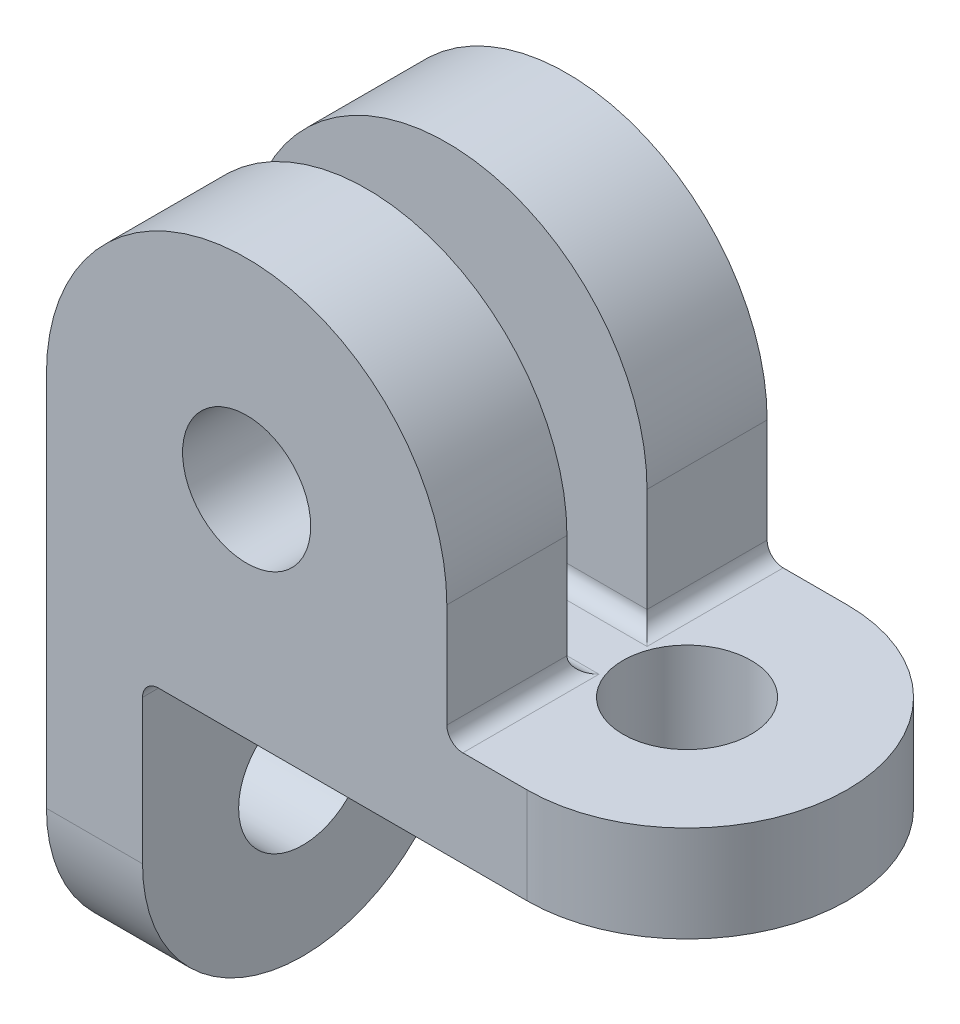
ISO-10303-21;
HEADER;
FILE_DESCRIPTION(('STEP AP214'),'2;1');
FILE_NAME('part.step','',(''),(''),'','','');
FILE_SCHEMA(('AUTOMOTIVE_DESIGN { 1 0 10303 214 1 1 1 1 }'));
ENDSEC;
DATA;
#1=APPLICATION_CONTEXT('core data for automotive mechanical design processes');
#2=APPLICATION_PROTOCOL_DEFINITION('international standard','automotive_design',2000,#1);
#3=PRODUCT_CONTEXT('',#1,'mechanical');
#4=PRODUCT('Part','Part','',(#3));
#5=PRODUCT_RELATED_PRODUCT_CATEGORY('part','',(#4));
#6=PRODUCT_DEFINITION_FORMATION('','',#4);
#7=PRODUCT_DEFINITION_CONTEXT('part definition',#1,'design');
#8=PRODUCT_DEFINITION('design','',#6,#7);
#9=PRODUCT_DEFINITION_SHAPE('','',#8);
#10=(LENGTH_UNIT() NAMED_UNIT(*) SI_UNIT(.MILLI.,.METRE.));
#11=(NAMED_UNIT(*) PLANE_ANGLE_UNIT() SI_UNIT($,.RADIAN.));
#12=(NAMED_UNIT(*) SI_UNIT($,.STERADIAN.) SOLID_ANGLE_UNIT());
#13=UNCERTAINTY_MEASURE_WITH_UNIT(LENGTH_MEASURE(1.E-05),#10,'distance_accuracy_value','');
#14=(GEOMETRIC_REPRESENTATION_CONTEXT(3) GLOBAL_UNCERTAINTY_ASSIGNED_CONTEXT((#13)) GLOBAL_UNIT_ASSIGNED_CONTEXT((#10,
#11,#12)) REPRESENTATION_CONTEXT('',''));
#15=CARTESIAN_POINT('',(0.,0.,0.));
#16=DIRECTION('',(0.,0.,1.));
#17=DIRECTION('',(1.,0.,0.));
#18=AXIS2_PLACEMENT_3D('',#15,#16,#17);
#19=CARTESIAN_POINT('',(-26.,-2.,20.));
#20=DIRECTION('',(0.,0.,-1.));
#21=DIRECTION('',(-1.,0.,0.));
#22=AXIS2_PLACEMENT_3D('',#19,#20,#21);
#23=CYLINDRICAL_SURFACE('',#22,2.);
#24=DIRECTION('',(0.,0.,1.));
#25=VECTOR('',#24,1.);
#26=CARTESIAN_POINT('',(-28.,-2.,20.));
#27=LINE('',#26,#25);
#28=CARTESIAN_POINT('',(-28.,-1.99999999999999,-20.));
#29=VERTEX_POINT('',#28);
#30=CARTESIAN_POINT('',(-28.,-1.99999999999999,20.));
#31=VERTEX_POINT('',#30);
#32=EDGE_CURVE('E309',#29,#31,#27,.T.);
#33=ORIENTED_EDGE('',*,*,#32,.F.);
#34=CARTESIAN_POINT('',(-26.,-2.,-20.));
#35=DIRECTION('',(0.,0.,1.));
#36=DIRECTION('',(1.,0.,0.));
#37=AXIS2_PLACEMENT_3D('',#34,#35,#36);
#38=CIRCLE('',#37,2.);
#39=CARTESIAN_POINT('',(-26.,0.,-20.));
#40=VERTEX_POINT('',#39);
#41=EDGE_CURVE('E53',#29,#40,#38,.F.);
#42=ORIENTED_EDGE('',*,*,#41,.T.);
#43=DIRECTION('',(0.,0.,1.));
#44=VECTOR('',#43,1.);
#45=CARTESIAN_POINT('',(-26.,0.,20.));
#46=LINE('',#45,#44);
#47=CARTESIAN_POINT('',(-26.,0.,20.));
#48=VERTEX_POINT('',#47);
#49=EDGE_CURVE('E313',#48,#40,#46,.F.);
#50=ORIENTED_EDGE('',*,*,#49,.F.);
#51=CARTESIAN_POINT('',(-26.,-2.,20.));
#52=DIRECTION('',(0.,0.,-1.));
#53=DIRECTION('',(-1.,0.,0.));
#54=AXIS2_PLACEMENT_3D('',#51,#52,#53);
#55=CIRCLE('',#54,2.);
#56=EDGE_CURVE('E11',#48,#31,#55,.F.);
#57=ORIENTED_EDGE('',*,*,#56,.T.);
#58=EDGE_LOOP('',(#33,#42,#50,#57));
#59=FACE_BOUND('',#58,.T.);
#60=ADVANCED_FACE('F45',(#59),#23,.F.);
#61=CARTESIAN_POINT('',(12.,14.,-20.));
#62=DIRECTION('',(0.,0.,1.));
#63=DIRECTION('',(1.,0.,0.));
#64=AXIS2_PLACEMENT_3D('',#61,#62,#63);
#65=CYLINDRICAL_SURFACE('',#64,2.);
#66=DIRECTION('',(0.,0.,-1.));
#67=VECTOR('',#66,1.);
#68=CARTESIAN_POINT('',(10.,14.,-20.));
#69=LINE('',#68,#67);
#70=CARTESIAN_POINT('',(10.,14.,-5.));
#71=VERTEX_POINT('',#70);
#72=CARTESIAN_POINT('',(10.,14.,-20.));
#73=VERTEX_POINT('',#72);
#74=EDGE_CURVE('E294',#71,#73,#69,.T.);
#75=ORIENTED_EDGE('',*,*,#74,.F.);
#76=CARTESIAN_POINT('',(12.,14.,-3.));
#77=DIRECTION('',(-0.707106781186547,0.,0.707106781186547));
#78=DIRECTION('',(-0.707106781186547,0.,-0.707106781186547));
#79=AXIS2_PLACEMENT_3D('',#76,#77,#78);
#80=ELLIPSE('',#79,2.82842712474619,2.);
#81=CARTESIAN_POINT('',(12.,12.,-3.));
#82=VERTEX_POINT('',#81);
#83=EDGE_CURVE('E302',#71,#82,#80,.T.);
#84=ORIENTED_EDGE('',*,*,#83,.T.);
#85=DIRECTION('',(0.,0.,-1.));
#86=VECTOR('',#85,1.);
#87=CARTESIAN_POINT('',(12.,12.,-20.));
#88=LINE('',#87,#86);
#89=CARTESIAN_POINT('',(12.,12.,-20.));
#90=VERTEX_POINT('',#89);
#91=EDGE_CURVE('E298',#90,#82,#88,.F.);
#92=ORIENTED_EDGE('',*,*,#91,.F.);
#93=CARTESIAN_POINT('',(12.,14.,-20.));
#94=DIRECTION('',(0.,0.,1.));
#95=DIRECTION('',(1.,0.,0.));
#96=AXIS2_PLACEMENT_3D('',#93,#94,#95);
#97=CIRCLE('',#96,2.);
#98=EDGE_CURVE('E306',#90,#73,#97,.F.);
#99=ORIENTED_EDGE('',*,*,#98,.T.);
#100=EDGE_LOOP('',(#75,#84,#92,#99));
#101=FACE_BOUND('',#100,.T.);
#102=ADVANCED_FACE('F398',(#101),#65,.F.);
#103=CARTESIAN_POINT('',(-40.,14.,-3.));
#104=DIRECTION('',(-1.,0.,0.));
#105=DIRECTION('',(0.,0.,1.));
#106=AXIS2_PLACEMENT_3D('',#103,#104,#105);
#107=CYLINDRICAL_SURFACE('',#106,2.);
#108=DIRECTION('',(1.,0.,0.));
#109=VECTOR('',#108,1.);
#110=CARTESIAN_POINT('',(-40.,14.,-5.));
#111=LINE('',#110,#109);
#112=CARTESIAN_POINT('',(-40.,14.,-5.));
#113=VERTEX_POINT('',#112);
#114=EDGE_CURVE('E283',#113,#71,#111,.T.);
#115=ORIENTED_EDGE('',*,*,#114,.F.);
#116=CARTESIAN_POINT('',(-40.,14.,-3.));
#117=DIRECTION('',(1.,0.,0.));
#118=DIRECTION('',(0.,0.,-1.));
#119=AXIS2_PLACEMENT_3D('',#116,#117,#118);
#120=CIRCLE('',#119,2.);
#121=CARTESIAN_POINT('',(-40.,12.,-3.));
#122=VERTEX_POINT('',#121);
#123=EDGE_CURVE('E291',#113,#122,#120,.F.);
#124=ORIENTED_EDGE('',*,*,#123,.T.);
#125=DIRECTION('',(1.,0.,0.));
#126=VECTOR('',#125,1.);
#127=CARTESIAN_POINT('',(-40.,12.,-3.));
#128=LINE('',#127,#126);
#129=EDGE_CURVE('E287',#82,#122,#128,.F.);
#130=ORIENTED_EDGE('',*,*,#129,.F.);
#131=ORIENTED_EDGE('',*,*,#83,.F.);
#132=EDGE_LOOP('',(#115,#124,#130,#131));
#133=FACE_BOUND('',#132,.T.);
#134=ADVANCED_FACE('F402',(#133),#107,.F.);
#135=CARTESIAN_POINT('',(-40.,14.,3.));
#136=DIRECTION('',(-1.,0.,0.));
#137=DIRECTION('',(0.,0.,1.));
#138=AXIS2_PLACEMENT_3D('',#135,#136,#137);
#139=CYLINDRICAL_SURFACE('',#138,2.);
#140=DIRECTION('',(-1.,0.,0.));
#141=VECTOR('',#140,1.);
#142=CARTESIAN_POINT('',(-40.,14.,5.));
#143=LINE('',#142,#141);
#144=CARTESIAN_POINT('',(10.,14.,5.));
#145=VERTEX_POINT('',#144);
#146=CARTESIAN_POINT('',(-40.,14.,5.));
#147=VERTEX_POINT('',#146);
#148=EDGE_CURVE('E268',#145,#147,#143,.T.);
#149=ORIENTED_EDGE('',*,*,#148,.F.);
#150=CARTESIAN_POINT('',(12.,14.,3.));
#151=DIRECTION('',(-0.707106781186547,0.,-0.707106781186547));
#152=DIRECTION('',(0.707106781186547,0.,-0.707106781186547));
#153=AXIS2_PLACEMENT_3D('',#150,#151,#152);
#154=ELLIPSE('',#153,2.82842712474619,2.);
#155=CARTESIAN_POINT('',(12.,12.,3.));
#156=VERTEX_POINT('',#155);
#157=EDGE_CURVE('E276',#145,#156,#154,.F.);
#158=ORIENTED_EDGE('',*,*,#157,.T.);
#159=DIRECTION('',(-1.,0.,0.));
#160=VECTOR('',#159,1.);
#161=CARTESIAN_POINT('',(0.,12.,3.));
#162=LINE('',#161,#160);
#163=CARTESIAN_POINT('',(-40.,12.,3.));
#164=VERTEX_POINT('',#163);
#165=EDGE_CURVE('E272',#164,#156,#162,.F.);
#166=ORIENTED_EDGE('',*,*,#165,.F.);
#167=CARTESIAN_POINT('',(-40.,14.,3.));
#168=DIRECTION('',(1.,0.,0.));
#169=DIRECTION('',(0.,0.,-1.));
#170=AXIS2_PLACEMENT_3D('',#167,#168,#169);
#171=CIRCLE('',#170,2.);
#172=EDGE_CURVE('E280',#164,#147,#171,.F.);
#173=ORIENTED_EDGE('',*,*,#172,.T.);
#174=EDGE_LOOP('',(#149,#158,#166,#173));
#175=FACE_BOUND('',#174,.T.);
#176=ADVANCED_FACE('F407',(#175),#139,.F.);
#177=CARTESIAN_POINT('',(12.,14.,20.));
#178=DIRECTION('',(0.,0.,-1.));
#179=DIRECTION('',(-1.,0.,0.));
#180=AXIS2_PLACEMENT_3D('',#177,#178,#179);
#181=CYLINDRICAL_SURFACE('',#180,2.);
#182=DIRECTION('',(0.,0.,-1.));
#183=VECTOR('',#182,1.);
#184=CARTESIAN_POINT('',(10.,14.,20.));
#185=LINE('',#184,#183);
#186=CARTESIAN_POINT('',(10.,14.,20.));
#187=VERTEX_POINT('',#186);
#188=EDGE_CURVE('E251',#187,#145,#185,.T.);
#189=ORIENTED_EDGE('',*,*,#188,.F.);
#190=CARTESIAN_POINT('',(12.,14.,20.));
#191=DIRECTION('',(0.,0.,-1.));
#192=DIRECTION('',(-1.,0.,0.));
#193=AXIS2_PLACEMENT_3D('',#190,#191,#192);
#194=CIRCLE('',#193,2.);
#195=CARTESIAN_POINT('',(12.,12.,20.));
#196=VERTEX_POINT('',#195);
#197=EDGE_CURVE('E265',#187,#196,#194,.F.);
#198=ORIENTED_EDGE('',*,*,#197,.T.);
#199=DIRECTION('',(0.,0.,-1.));
#200=VECTOR('',#199,1.);
#201=CARTESIAN_POINT('',(12.,12.,0.));
#202=LINE('',#201,#200);
#203=EDGE_CURVE('E261',#156,#196,#202,.F.);
#204=ORIENTED_EDGE('',*,*,#203,.F.);
#205=ORIENTED_EDGE('',*,*,#157,.F.);
#206=EDGE_LOOP('',(#189,#198,#204,#205));
#207=FACE_BOUND('',#206,.T.);
#208=ADVANCED_FACE('F414',(#207),#181,.F.);
#209=CARTESIAN_POINT('',(-40.,-20.,0.));
#210=DIRECTION('',(-1.,0.,0.));
#211=DIRECTION('',(0.,0.,1.));
#212=AXIS2_PLACEMENT_3D('',#209,#210,#211);
#213=CYLINDRICAL_SURFACE('',#212,20.);
#214=DIRECTION('',(1.,0.,0.));
#215=VECTOR('',#214,1.);
#216=CARTESIAN_POINT('',(-40.,-20.,20.));
#217=LINE('',#216,#215);
#218=CARTESIAN_POINT('',(-40.,-20.,20.));
#219=VERTEX_POINT('',#218);
#220=CARTESIAN_POINT('',(-28.,-20.,20.));
#221=VERTEX_POINT('',#220);
#222=EDGE_CURVE('E226',#219,#221,#217,.T.);
#223=ORIENTED_EDGE('',*,*,#222,.F.);
#224=CARTESIAN_POINT('',(-40.,-20.,0.));
#225=DIRECTION('',(1.,0.,0.));
#226=DIRECTION('',(0.,0.,-1.));
#227=AXIS2_PLACEMENT_3D('',#224,#225,#226);
#228=CIRCLE('',#227,20.);
#229=CARTESIAN_POINT('',(-40.,-20.,-20.));
#230=VERTEX_POINT('',#229);
#231=EDGE_CURVE('E245',#230,#219,#228,.F.);
#232=ORIENTED_EDGE('',*,*,#231,.F.);
#233=DIRECTION('',(1.,0.,0.));
#234=VECTOR('',#233,1.);
#235=CARTESIAN_POINT('',(-40.,-20.,-20.));
#236=LINE('',#235,#234);
#237=CARTESIAN_POINT('',(-28.,-20.,-20.));
#238=VERTEX_POINT('',#237);
#239=EDGE_CURVE('E241',#238,#230,#236,.F.);
#240=ORIENTED_EDGE('',*,*,#239,.F.);
#241=CARTESIAN_POINT('',(-28.,-20.,0.));
#242=DIRECTION('',(-1.,0.,0.));
#243=DIRECTION('',(0.,0.,1.));
#244=AXIS2_PLACEMENT_3D('',#241,#242,#243);
#245=CIRCLE('',#244,20.);
#246=EDGE_CURVE('E248',#221,#238,#245,.F.);
#247=ORIENTED_EDGE('',*,*,#246,.F.);
#248=EDGE_LOOP('',(#223,#232,#240,#247));
#249=FACE_BOUND('',#248,.T.);
#250=ADVANCED_FACE('F393',(#249),#213,.T.);
#251=CARTESIAN_POINT('',(0.,0.,0.));
#252=DIRECTION('',(0.,1.,0.));
#253=DIRECTION('',(0.,0.,1.));
#254=AXIS2_PLACEMENT_3D('',#251,#252,#253);
#255=PLANE('',#254);
#256=CARTESIAN_POINT('',(20.,0.,0.));
#257=DIRECTION('',(0.,1.,0.));
#258=DIRECTION('',(0.,0.,1.));
#259=AXIS2_PLACEMENT_3D('',#256,#257,#258);
#260=CIRCLE('',#259,8.);
#261=CARTESIAN_POINT('',(20.,0.,8.));
#262=VERTEX_POINT('',#261);
#263=EDGE_CURVE('E233',#262,#262,#260,.T.);
#264=ORIENTED_EDGE('',*,*,#263,.T.);
#265=EDGE_LOOP('',(#264));
#266=FACE_BOUND('',#265,.T.);
#267=DIRECTION('',(1.,0.,0.));
#268=VECTOR('',#267,1.);
#269=CARTESIAN_POINT('',(-40.,0.,20.));
#270=LINE('',#269,#268);
#271=CARTESIAN_POINT('',(20.,0.,20.));
#272=VERTEX_POINT('',#271);
#273=EDGE_CURVE('E154',#48,#272,#270,.T.);
#274=ORIENTED_EDGE('',*,*,#273,.F.);
#275=ORIENTED_EDGE('',*,*,#49,.T.);
#276=DIRECTION('',(-1.,0.,0.));
#277=VECTOR('',#276,1.);
#278=CARTESIAN_POINT('',(-40.,0.,-20.));
#279=LINE('',#278,#277);
#280=CARTESIAN_POINT('',(20.,0.,-20.));
#281=VERTEX_POINT('',#280);
#282=EDGE_CURVE('E164',#281,#40,#279,.T.);
#283=ORIENTED_EDGE('',*,*,#282,.F.);
#284=CARTESIAN_POINT('',(20.,0.,0.));
#285=DIRECTION('',(0.,1.,0.));
#286=DIRECTION('',(0.,0.,1.));
#287=AXIS2_PLACEMENT_3D('',#284,#285,#286);
#288=CIRCLE('',#287,20.);
#289=EDGE_CURVE('E167',#281,#272,#288,.F.);
#290=ORIENTED_EDGE('',*,*,#289,.T.);
#291=EDGE_LOOP('',(#274,#275,#283,#290));
#292=FACE_BOUND('',#291,.T.);
#293=ADVANCED_FACE('F168',(#266,#292),#255,.F.);
#294=CARTESIAN_POINT('',(-15.,27.,-5.));
#295=DIRECTION('',(0.,0.,-1.));
#296=DIRECTION('',(-1.,0.,0.));
#297=AXIS2_PLACEMENT_3D('',#294,#295,#296);
#298=CYLINDRICAL_SURFACE('',#297,25.);
#299=DIRECTION('',(0.,0.,-1.));
#300=VECTOR('',#299,1.);
#301=CARTESIAN_POINT('',(-40.,27.,-20.));
#302=LINE('',#301,#300);
#303=CARTESIAN_POINT('',(-40.,27.,-5.));
#304=VERTEX_POINT('',#303);
#305=CARTESIAN_POINT('',(-40.,27.,-20.));
#306=VERTEX_POINT('',#305);
#307=EDGE_CURVE('E206',#304,#306,#302,.T.);
#308=ORIENTED_EDGE('',*,*,#307,.F.);
#309=CARTESIAN_POINT('',(-15.,27.,-5.));
#310=DIRECTION('',(0.,0.,1.));
#311=DIRECTION('',(1.,0.,0.));
#312=AXIS2_PLACEMENT_3D('',#309,#310,#311);
#313=CIRCLE('',#312,25.);
#314=CARTESIAN_POINT('',(10.,27.,-5.));
#315=VERTEX_POINT('',#314);
#316=EDGE_CURVE('E220',#315,#304,#313,.T.);
#317=ORIENTED_EDGE('',*,*,#316,.F.);
#318=DIRECTION('',(0.,0.,1.));
#319=VECTOR('',#318,1.);
#320=CARTESIAN_POINT('',(10.,27.,-5.));
#321=LINE('',#320,#319);
#322=CARTESIAN_POINT('',(10.,27.,-20.));
#323=VERTEX_POINT('',#322);
#324=EDGE_CURVE('E216',#323,#315,#321,.T.);
#325=ORIENTED_EDGE('',*,*,#324,.F.);
#326=CARTESIAN_POINT('',(-15.,27.,-20.));
#327=DIRECTION('',(0.,0.,1.));
#328=DIRECTION('',(1.,0.,0.));
#329=AXIS2_PLACEMENT_3D('',#326,#327,#328);
#330=CIRCLE('',#329,25.);
#331=EDGE_CURVE('E223',#306,#323,#330,.F.);
#332=ORIENTED_EDGE('',*,*,#331,.F.);
#333=EDGE_LOOP('',(#308,#317,#325,#332));
#334=FACE_BOUND('',#333,.T.);
#335=ADVANCED_FACE('F425',(#334),#298,.T.);
#336=CARTESIAN_POINT('',(-15.,27.,20.));
#337=DIRECTION('',(0.,0.,1.));
#338=DIRECTION('',(1.,0.,0.));
#339=AXIS2_PLACEMENT_3D('',#336,#337,#338);
#340=CYLINDRICAL_SURFACE('',#339,25.);
#341=DIRECTION('',(0.,0.,1.));
#342=VECTOR('',#341,1.);
#343=CARTESIAN_POINT('',(-40.,27.,-20.));
#344=LINE('',#343,#342);
#345=CARTESIAN_POINT('',(-40.,27.,20.));
#346=VERTEX_POINT('',#345);
#347=CARTESIAN_POINT('',(-40.,27.,5.));
#348=VERTEX_POINT('',#347);
#349=EDGE_CURVE('E192',#346,#348,#344,.F.);
#350=ORIENTED_EDGE('',*,*,#349,.F.);
#351=CARTESIAN_POINT('',(-15.,27.,20.));
#352=DIRECTION('',(0.,0.,-1.));
#353=DIRECTION('',(-1.,0.,0.));
#354=AXIS2_PLACEMENT_3D('',#351,#352,#353);
#355=CIRCLE('',#354,25.);
#356=CARTESIAN_POINT('',(10.,27.,20.));
#357=VERTEX_POINT('',#356);
#358=EDGE_CURVE('E200',#357,#346,#355,.F.);
#359=ORIENTED_EDGE('',*,*,#358,.F.);
#360=DIRECTION('',(0.,0.,1.));
#361=VECTOR('',#360,1.);
#362=CARTESIAN_POINT('',(10.,27.,20.));
#363=LINE('',#362,#361);
#364=CARTESIAN_POINT('',(10.,27.,5.));
#365=VERTEX_POINT('',#364);
#366=EDGE_CURVE('E196',#365,#357,#363,.T.);
#367=ORIENTED_EDGE('',*,*,#366,.F.);
#368=CARTESIAN_POINT('',(-15.,27.,5.));
#369=DIRECTION('',(0.,0.,1.));
#370=DIRECTION('',(1.,0.,0.));
#371=AXIS2_PLACEMENT_3D('',#368,#369,#370);
#372=CIRCLE('',#371,25.);
#373=EDGE_CURVE('E203',#348,#365,#372,.F.);
#374=ORIENTED_EDGE('',*,*,#373,.F.);
#375=EDGE_LOOP('',(#350,#359,#367,#374));
#376=FACE_BOUND('',#375,.T.);
#377=ADVANCED_FACE('F431',(#376),#340,.T.);
#378=CARTESIAN_POINT('',(20.,0.,0.));
#379=DIRECTION('',(0.,-1.,0.));
#380=DIRECTION('',(0.,0.,-1.));
#381=AXIS2_PLACEMENT_3D('',#378,#379,#380);
#382=CYLINDRICAL_SURFACE('',#381,20.);
#383=DIRECTION('',(0.,-1.,0.));
#384=VECTOR('',#383,1.);
#385=CARTESIAN_POINT('',(20.,12.,20.));
#386=LINE('',#385,#384);
#387=CARTESIAN_POINT('',(20.,12.,20.));
#388=VERTEX_POINT('',#387);
#389=EDGE_CURVE('E160',#272,#388,#386,.F.);
#390=ORIENTED_EDGE('',*,*,#389,.F.);
#391=ORIENTED_EDGE('',*,*,#289,.F.);
#392=DIRECTION('',(0.,-1.,0.));
#393=VECTOR('',#392,1.);
#394=CARTESIAN_POINT('',(20.,12.,-20.));
#395=LINE('',#394,#393);
#396=CARTESIAN_POINT('',(20.,12.,-20.));
#397=VERTEX_POINT('',#396);
#398=EDGE_CURVE('E175',#397,#281,#395,.T.);
#399=ORIENTED_EDGE('',*,*,#398,.F.);
#400=CARTESIAN_POINT('',(20.,12.,0.));
#401=DIRECTION('',(0.,1.,0.));
#402=DIRECTION('',(0.,0.,1.));
#403=AXIS2_PLACEMENT_3D('',#400,#401,#402);
#404=CIRCLE('',#403,20.);
#405=EDGE_CURVE('E174',#388,#397,#404,.T.);
#406=ORIENTED_EDGE('',*,*,#405,.F.);
#407=EDGE_LOOP('',(#390,#391,#399,#406));
#408=FACE_BOUND('',#407,.T.);
#409=ADVANCED_FACE('F178',(#408),#382,.T.);
#410=CARTESIAN_POINT('',(-40.,12.,-20.));
#411=DIRECTION('',(0.,0.,1.));
#412=DIRECTION('',(1.,0.,0.));
#413=AXIS2_PLACEMENT_3D('',#410,#411,#412);
#414=PLANE('',#413);
#415=CARTESIAN_POINT('',(-15.,27.,-20.));
#416=DIRECTION('',(0.,0.,1.));
#417=DIRECTION('',(1.,0.,0.));
#418=AXIS2_PLACEMENT_3D('',#415,#416,#417);
#419=CIRCLE('',#418,8.);
#420=CARTESIAN_POINT('',(-7.,27.,-20.));
#421=VERTEX_POINT('',#420);
#422=EDGE_CURVE('E232',#421,#421,#419,.T.);
#423=ORIENTED_EDGE('',*,*,#422,.T.);
#424=EDGE_LOOP('',(#423));
#425=FACE_BOUND('',#424,.T.);
#426=DIRECTION('',(0.,1.,0.));
#427=VECTOR('',#426,1.);
#428=CARTESIAN_POINT('',(-28.,-40.,-20.));
#429=LINE('',#428,#427);
#430=EDGE_CURVE('E369',#238,#29,#429,.T.);
#431=ORIENTED_EDGE('',*,*,#430,.F.);
#432=ORIENTED_EDGE('',*,*,#239,.T.);
#433=DIRECTION('',(0.,-1.,0.));
#434=VECTOR('',#433,1.);
#435=CARTESIAN_POINT('',(-40.,12.,-20.));
#436=LINE('',#435,#434);
#437=EDGE_CURVE('E180',#306,#230,#436,.T.);
#438=ORIENTED_EDGE('',*,*,#437,.F.);
#439=ORIENTED_EDGE('',*,*,#331,.T.);
#440=DIRECTION('',(0.,-1.,0.));
#441=VECTOR('',#440,1.);
#442=CARTESIAN_POINT('',(10.,52.,-20.));
#443=LINE('',#442,#441);
#444=EDGE_CURVE('E231',#323,#73,#443,.T.);
#445=ORIENTED_EDGE('',*,*,#444,.T.);
#446=ORIENTED_EDGE('',*,*,#98,.F.);
#447=DIRECTION('',(-1.,0.,0.));
#448=VECTOR('',#447,1.);
#449=CARTESIAN_POINT('',(-40.,12.,-20.));
#450=LINE('',#449,#448);
#451=EDGE_CURVE('E163',#397,#90,#450,.T.);
#452=ORIENTED_EDGE('',*,*,#451,.F.);
#453=ORIENTED_EDGE('',*,*,#398,.T.);
#454=ORIENTED_EDGE('',*,*,#282,.T.);
#455=ORIENTED_EDGE('',*,*,#41,.F.);
#456=EDGE_LOOP('',(#431,#432,#438,#439,#445,#446,#452,#453,#454,#455));
#457=FACE_BOUND('',#456,.T.);
#458=ADVANCED_FACE('F318',(#425,#457),#414,.F.);
#459=CARTESIAN_POINT('',(-40.,12.,-20.));
#460=DIRECTION('',(1.,0.,0.));
#461=DIRECTION('',(0.,0.,-1.));
#462=AXIS2_PLACEMENT_3D('',#459,#460,#461);
#463=PLANE('',#462);
#464=CARTESIAN_POINT('',(-40.,-20.,0.));
#465=DIRECTION('',(-1.,0.,0.));
#466=DIRECTION('',(0.,0.,1.));
#467=AXIS2_PLACEMENT_3D('',#464,#465,#466);
#468=CIRCLE('',#467,8.);
#469=CARTESIAN_POINT('',(-40.,-20.,8.));
#470=VERTEX_POINT('',#469);
#471=EDGE_CURVE('E257',#470,#470,#468,.T.);
#472=ORIENTED_EDGE('',*,*,#471,.F.);
#473=EDGE_LOOP('',(#472));
#474=FACE_BOUND('',#473,.T.);
#475=ORIENTED_EDGE('',*,*,#437,.T.);
#476=ORIENTED_EDGE('',*,*,#231,.T.);
#477=DIRECTION('',(0.,-1.,0.));
#478=VECTOR('',#477,1.);
#479=CARTESIAN_POINT('',(-40.,12.,20.));
#480=LINE('',#479,#478);
#481=EDGE_CURVE('E186',#346,#219,#480,.T.);
#482=ORIENTED_EDGE('',*,*,#481,.F.);
#483=ORIENTED_EDGE('',*,*,#349,.T.);
#484=DIRECTION('',(0.,-1.,0.));
#485=VECTOR('',#484,1.);
#486=CARTESIAN_POINT('',(-40.,52.,5.));
#487=LINE('',#486,#485);
#488=EDGE_CURVE('E211',#348,#147,#487,.T.);
#489=ORIENTED_EDGE('',*,*,#488,.T.);
#490=ORIENTED_EDGE('',*,*,#172,.F.);
#491=DIRECTION('',(0.,0.,1.));
#492=VECTOR('',#491,1.);
#493=CARTESIAN_POINT('',(-40.,12.,-20.));
#494=LINE('',#493,#492);
#495=EDGE_CURVE('E334',#122,#164,#494,.T.);
#496=ORIENTED_EDGE('',*,*,#495,.F.);
#497=ORIENTED_EDGE('',*,*,#123,.F.);
#498=DIRECTION('',(0.,-1.,0.));
#499=VECTOR('',#498,1.);
#500=CARTESIAN_POINT('',(-40.,52.,-5.));
#501=LINE('',#500,#499);
#502=EDGE_CURVE('E352',#304,#113,#501,.T.);
#503=ORIENTED_EDGE('',*,*,#502,.F.);
#504=ORIENTED_EDGE('',*,*,#307,.T.);
#505=EDGE_LOOP('',(#475,#476,#482,#483,#489,#490,#496,#497,#503,#504));
#506=FACE_BOUND('',#505,.T.);
#507=ADVANCED_FACE('F382',(#474,#506),#463,.F.);
#508=CARTESIAN_POINT('',(-40.,12.,20.));
#509=DIRECTION('',(0.,0.,-1.));
#510=DIRECTION('',(-1.,0.,0.));
#511=AXIS2_PLACEMENT_3D('',#508,#509,#510);
#512=PLANE('',#511);
#513=ORIENTED_EDGE('',*,*,#56,.F.);
#514=ORIENTED_EDGE('',*,*,#273,.T.);
#515=ORIENTED_EDGE('',*,*,#389,.T.);
#516=DIRECTION('',(1.,0.,0.));
#517=VECTOR('',#516,1.);
#518=CARTESIAN_POINT('',(-40.,12.,20.));
#519=LINE('',#518,#517);
#520=EDGE_CURVE('E328',#196,#388,#519,.T.);
#521=ORIENTED_EDGE('',*,*,#520,.F.);
#522=ORIENTED_EDGE('',*,*,#197,.F.);
#523=DIRECTION('',(0.,-1.,0.));
#524=VECTOR('',#523,1.);
#525=CARTESIAN_POINT('',(10.,52.,20.));
#526=LINE('',#525,#524);
#527=EDGE_CURVE('E321',#357,#187,#526,.T.);
#528=ORIENTED_EDGE('',*,*,#527,.F.);
#529=ORIENTED_EDGE('',*,*,#358,.T.);
#530=ORIENTED_EDGE('',*,*,#481,.T.);
#531=ORIENTED_EDGE('',*,*,#222,.T.);
#532=DIRECTION('',(0.,1.,0.));
#533=VECTOR('',#532,1.);
#534=CARTESIAN_POINT('',(-28.,-40.,20.));
#535=LINE('',#534,#533);
#536=EDGE_CURVE('E256',#221,#31,#535,.T.);
#537=ORIENTED_EDGE('',*,*,#536,.T.);
#538=EDGE_LOOP('',(#513,#514,#515,#521,#522,#528,#529,#530,#531,#537));
#539=FACE_BOUND('',#538,.T.);
#540=CARTESIAN_POINT('',(-15.,27.,20.));
#541=DIRECTION('',(0.,0.,1.));
#542=DIRECTION('',(1.,0.,0.));
#543=AXIS2_PLACEMENT_3D('',#540,#541,#542);
#544=CIRCLE('',#543,8.);
#545=CARTESIAN_POINT('',(-7.,27.,20.));
#546=VERTEX_POINT('',#545);
#547=EDGE_CURVE('E212',#546,#546,#544,.T.);
#548=ORIENTED_EDGE('',*,*,#547,.F.);
#549=EDGE_LOOP('',(#548));
#550=FACE_BOUND('',#549,.T.);
#551=ADVANCED_FACE('F156',(#539,#550),#512,.F.);
#552=CARTESIAN_POINT('',(0.,12.,0.));
#553=DIRECTION('',(0.,1.,0.));
#554=DIRECTION('',(0.,0.,1.));
#555=AXIS2_PLACEMENT_3D('',#552,#553,#554);
#556=PLANE('',#555);
#557=CARTESIAN_POINT('',(20.,12.,0.));
#558=DIRECTION('',(0.,1.,0.));
#559=DIRECTION('',(0.,0.,1.));
#560=AXIS2_PLACEMENT_3D('',#557,#558,#559);
#561=CIRCLE('',#560,8.);
#562=CARTESIAN_POINT('',(20.,12.,8.));
#563=VERTEX_POINT('',#562);
#564=EDGE_CURVE('E237',#563,#563,#561,.T.);
#565=ORIENTED_EDGE('',*,*,#564,.F.);
#566=EDGE_LOOP('',(#565));
#567=FACE_BOUND('',#566,.T.);
#568=ORIENTED_EDGE('',*,*,#451,.T.);
#569=ORIENTED_EDGE('',*,*,#91,.T.);
#570=ORIENTED_EDGE('',*,*,#129,.T.);
#571=ORIENTED_EDGE('',*,*,#495,.T.);
#572=ORIENTED_EDGE('',*,*,#165,.T.);
#573=ORIENTED_EDGE('',*,*,#203,.T.);
#574=ORIENTED_EDGE('',*,*,#520,.T.);
#575=ORIENTED_EDGE('',*,*,#405,.T.);
#576=EDGE_LOOP('',(#568,#569,#570,#571,#572,#573,#574,#575));
#577=FACE_BOUND('',#576,.T.);
#578=ADVANCED_FACE('F448',(#567,#577),#556,.T.);
#579=CARTESIAN_POINT('',(10.,52.,20.));
#580=DIRECTION('',(-1.,0.,0.));
#581=DIRECTION('',(0.,0.,1.));
#582=AXIS2_PLACEMENT_3D('',#579,#580,#581);
#583=PLANE('',#582);
#584=ORIENTED_EDGE('',*,*,#527,.T.);
#585=ORIENTED_EDGE('',*,*,#188,.T.);
#586=DIRECTION('',(0.,-1.,0.));
#587=VECTOR('',#586,1.);
#588=CARTESIAN_POINT('',(10.,52.,5.));
#589=LINE('',#588,#587);
#590=EDGE_CURVE('E325',#365,#145,#589,.T.);
#591=ORIENTED_EDGE('',*,*,#590,.F.);
#592=ORIENTED_EDGE('',*,*,#366,.T.);
#593=EDGE_LOOP('',(#584,#585,#591,#592));
#594=FACE_BOUND('',#593,.T.);
#595=ADVANCED_FACE('F454',(#594),#583,.F.);
#596=CARTESIAN_POINT('',(-40.,52.,5.));
#597=DIRECTION('',(0.,0.,1.));
#598=DIRECTION('',(1.,0.,0.));
#599=AXIS2_PLACEMENT_3D('',#596,#597,#598);
#600=PLANE('',#599);
#601=CARTESIAN_POINT('',(-15.,27.,5.));
#602=DIRECTION('',(0.,0.,1.));
#603=DIRECTION('',(1.,0.,0.));
#604=AXIS2_PLACEMENT_3D('',#601,#602,#603);
#605=CIRCLE('',#604,8.);
#606=CARTESIAN_POINT('',(-7.,27.,5.));
#607=VERTEX_POINT('',#606);
#608=EDGE_CURVE('E207',#607,#607,#605,.T.);
#609=ORIENTED_EDGE('',*,*,#608,.T.);
#610=EDGE_LOOP('',(#609));
#611=FACE_BOUND('',#610,.T.);
#612=ORIENTED_EDGE('',*,*,#590,.T.);
#613=ORIENTED_EDGE('',*,*,#148,.T.);
#614=ORIENTED_EDGE('',*,*,#488,.F.);
#615=ORIENTED_EDGE('',*,*,#373,.T.);
#616=EDGE_LOOP('',(#612,#613,#614,#615));
#617=FACE_BOUND('',#616,.T.);
#618=ADVANCED_FACE('F458',(#611,#617),#600,.F.);
#619=CARTESIAN_POINT('',(-15.,27.,-20.));
#620=DIRECTION('',(0.,0.,1.));
#621=DIRECTION('',(1.,0.,0.));
#622=AXIS2_PLACEMENT_3D('',#619,#620,#621);
#623=CYLINDRICAL_SURFACE('',#622,8.);
#624=ORIENTED_EDGE('',*,*,#547,.T.);
#625=EDGE_LOOP('',(#624));
#626=FACE_BOUND('',#625,.T.);
#627=ORIENTED_EDGE('',*,*,#608,.F.);
#628=EDGE_LOOP('',(#627));
#629=FACE_BOUND('',#628,.T.);
#630=ADVANCED_FACE('F462',(#626,#629),#623,.F.);
#631=CARTESIAN_POINT('',(-40.,52.,-5.));
#632=DIRECTION('',(0.,0.,1.));
#633=DIRECTION('',(1.,0.,0.));
#634=AXIS2_PLACEMENT_3D('',#631,#632,#633);
#635=PLANE('',#634);
#636=CARTESIAN_POINT('',(-15.,27.,-5.));
#637=DIRECTION('',(0.,0.,1.));
#638=DIRECTION('',(1.,0.,0.));
#639=AXIS2_PLACEMENT_3D('',#636,#637,#638);
#640=CIRCLE('',#639,8.);
#641=CARTESIAN_POINT('',(-7.,27.,-5.));
#642=VERTEX_POINT('',#641);
#643=EDGE_CURVE('E227',#642,#642,#640,.F.);
#644=ORIENTED_EDGE('',*,*,#643,.T.);
#645=EDGE_LOOP('',(#644));
#646=FACE_BOUND('',#645,.T.);
#647=ORIENTED_EDGE('',*,*,#502,.T.);
#648=ORIENTED_EDGE('',*,*,#114,.T.);
#649=DIRECTION('',(0.,-1.,0.));
#650=VECTOR('',#649,1.);
#651=CARTESIAN_POINT('',(10.,52.,-5.));
#652=LINE('',#651,#650);
#653=EDGE_CURVE('E356',#315,#71,#652,.T.);
#654=ORIENTED_EDGE('',*,*,#653,.F.);
#655=ORIENTED_EDGE('',*,*,#316,.T.);
#656=EDGE_LOOP('',(#647,#648,#654,#655));
#657=FACE_BOUND('',#656,.T.);
#658=ADVANCED_FACE('F466',(#646,#657),#635,.T.);
#659=CARTESIAN_POINT('',(10.,52.,-20.));
#660=DIRECTION('',(1.,0.,0.));
#661=DIRECTION('',(0.,0.,-1.));
#662=AXIS2_PLACEMENT_3D('',#659,#660,#661);
#663=PLANE('',#662);
#664=ORIENTED_EDGE('',*,*,#653,.T.);
#665=ORIENTED_EDGE('',*,*,#74,.T.);
#666=ORIENTED_EDGE('',*,*,#444,.F.);
#667=ORIENTED_EDGE('',*,*,#324,.T.);
#668=EDGE_LOOP('',(#664,#665,#666,#667));
#669=FACE_BOUND('',#668,.T.);
#670=ADVANCED_FACE('F470',(#669),#663,.T.);
#671=CARTESIAN_POINT('',(-15.,27.,20.));
#672=DIRECTION('',(0.,0.,-1.));
#673=DIRECTION('',(-1.,0.,0.));
#674=AXIS2_PLACEMENT_3D('',#671,#672,#673);
#675=CYLINDRICAL_SURFACE('',#674,8.);
#676=ORIENTED_EDGE('',*,*,#643,.F.);
#677=EDGE_LOOP('',(#676));
#678=FACE_BOUND('',#677,.T.);
#679=ORIENTED_EDGE('',*,*,#422,.F.);
#680=EDGE_LOOP('',(#679));
#681=FACE_BOUND('',#680,.T.);
#682=ADVANCED_FACE('F474',(#678,#681),#675,.F.);
#683=CARTESIAN_POINT('',(20.,-28.,0.));
#684=DIRECTION('',(0.,1.,0.));
#685=DIRECTION('',(0.,0.,1.));
#686=AXIS2_PLACEMENT_3D('',#683,#684,#685);
#687=CYLINDRICAL_SURFACE('',#686,8.);
#688=ORIENTED_EDGE('',*,*,#564,.T.);
#689=EDGE_LOOP('',(#688));
#690=FACE_BOUND('',#689,.T.);
#691=ORIENTED_EDGE('',*,*,#263,.F.);
#692=EDGE_LOOP('',(#691));
#693=FACE_BOUND('',#692,.T.);
#694=ADVANCED_FACE('F478',(#690,#693),#687,.F.);
#695=CARTESIAN_POINT('',(-28.,-40.,20.));
#696=DIRECTION('',(-1.,0.,0.));
#697=DIRECTION('',(0.,0.,1.));
#698=AXIS2_PLACEMENT_3D('',#695,#696,#697);
#699=PLANE('',#698);
#700=CARTESIAN_POINT('',(-28.,-20.,0.));
#701=DIRECTION('',(-1.,0.,0.));
#702=DIRECTION('',(0.,0.,1.));
#703=AXIS2_PLACEMENT_3D('',#700,#701,#702);
#704=CIRCLE('',#703,8.);
#705=CARTESIAN_POINT('',(-28.,-20.,8.));
#706=VERTEX_POINT('',#705);
#707=EDGE_CURVE('E252',#706,#706,#704,.T.);
#708=ORIENTED_EDGE('',*,*,#707,.T.);
#709=EDGE_LOOP('',(#708));
#710=FACE_BOUND('',#709,.T.);
#711=ORIENTED_EDGE('',*,*,#430,.T.);
#712=ORIENTED_EDGE('',*,*,#32,.T.);
#713=ORIENTED_EDGE('',*,*,#536,.F.);
#714=ORIENTED_EDGE('',*,*,#246,.T.);
#715=EDGE_LOOP('',(#711,#712,#713,#714));
#716=FACE_BOUND('',#715,.T.);
#717=ADVANCED_FACE('F396',(#710,#716),#699,.F.);
#718=CARTESIAN_POINT('',(0.,-20.,0.));
#719=DIRECTION('',(-1.,0.,0.));
#720=DIRECTION('',(0.,0.,1.));
#721=AXIS2_PLACEMENT_3D('',#718,#719,#720);
#722=CYLINDRICAL_SURFACE('',#721,8.);
#723=ORIENTED_EDGE('',*,*,#471,.T.);
#724=EDGE_LOOP('',(#723));
#725=FACE_BOUND('',#724,.T.);
#726=ORIENTED_EDGE('',*,*,#707,.F.);
#727=EDGE_LOOP('',(#726));
#728=FACE_BOUND('',#727,.T.);
#729=ADVANCED_FACE('F379',(#725,#728),#722,.F.);
#730=CLOSED_SHELL('',(#60,#102,#134,#176,#208,#250,#293,#335,#377,#409,#458,#507,#551,#578,#595,
#618,#630,#658,#670,#682,#694,#717,#729));
#731=MANIFOLD_SOLID_BREP('B2',#730);
#732=ADVANCED_BREP_SHAPE_REPRESENTATION('',(#18,#731),#14);
#733=SHAPE_DEFINITION_REPRESENTATION(#9,#732);
ENDSEC;
END-ISO-10303-21;
